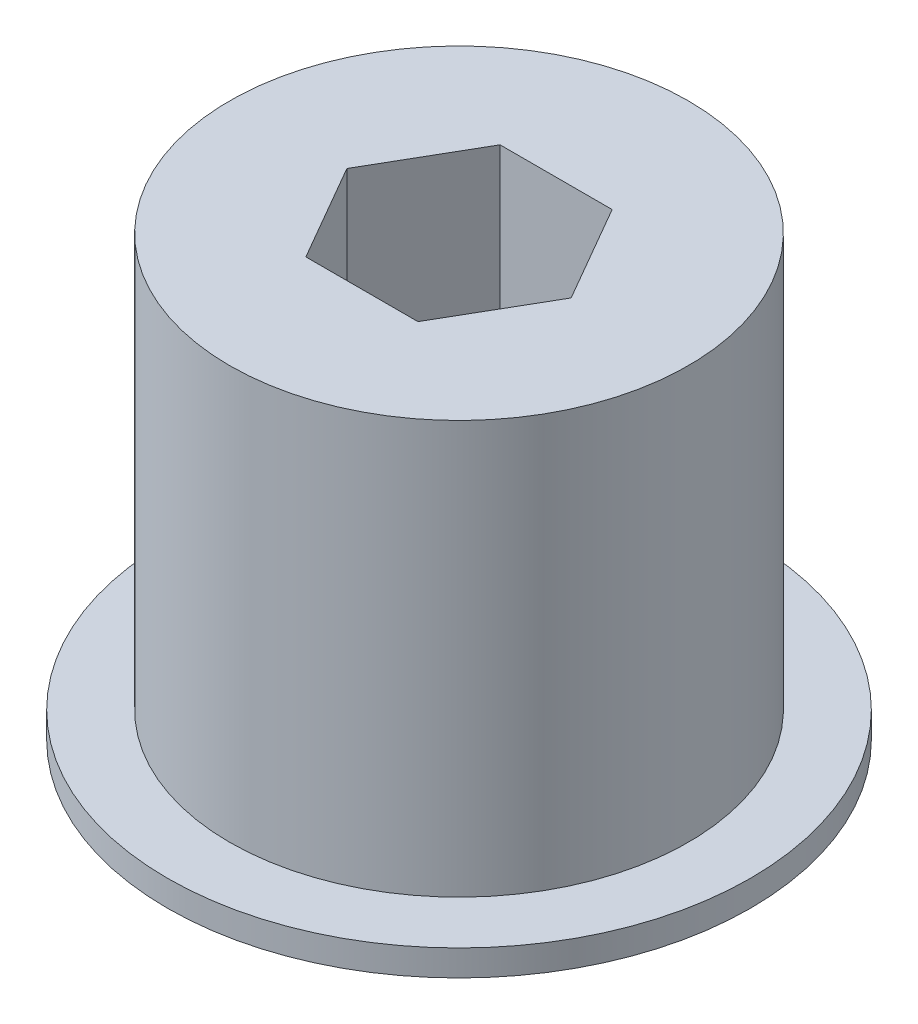
ISO-10303-21;
HEADER;
FILE_DESCRIPTION(('STEP AP214'),'2;1');
FILE_NAME('part.step','',(''),(''),'','','');
FILE_SCHEMA(('AUTOMOTIVE_DESIGN { 1 0 10303 214 1 1 1 1 }'));
ENDSEC;
DATA;
#1=APPLICATION_CONTEXT('core data for automotive mechanical design processes');
#2=APPLICATION_PROTOCOL_DEFINITION('international standard','automotive_design',2000,#1);
#3=PRODUCT_CONTEXT('',#1,'mechanical');
#4=PRODUCT('Part','Part','',(#3));
#5=PRODUCT_RELATED_PRODUCT_CATEGORY('part','',(#4));
#6=PRODUCT_DEFINITION_FORMATION('','',#4);
#7=PRODUCT_DEFINITION_CONTEXT('part definition',#1,'design');
#8=PRODUCT_DEFINITION('design','',#6,#7);
#9=PRODUCT_DEFINITION_SHAPE('','',#8);
#10=(LENGTH_UNIT() NAMED_UNIT(*) SI_UNIT(.MILLI.,.METRE.));
#11=(NAMED_UNIT(*) PLANE_ANGLE_UNIT() SI_UNIT($,.RADIAN.));
#12=(NAMED_UNIT(*) SI_UNIT($,.STERADIAN.) SOLID_ANGLE_UNIT());
#13=UNCERTAINTY_MEASURE_WITH_UNIT(LENGTH_MEASURE(1.E-05),#10,'distance_accuracy_value','');
#14=(GEOMETRIC_REPRESENTATION_CONTEXT(3) GLOBAL_UNCERTAINTY_ASSIGNED_CONTEXT((#13)) GLOBAL_UNIT_ASSIGNED_CONTEXT((#10,
#11,#12)) REPRESENTATION_CONTEXT('',''));
#15=CARTESIAN_POINT('',(0.,0.,0.));
#16=DIRECTION('',(0.,0.,1.));
#17=DIRECTION('',(1.,0.,0.));
#18=AXIS2_PLACEMENT_3D('',#15,#16,#17);
#19=CARTESIAN_POINT('',(0.,27.,0.));
#20=DIRECTION('',(0.,-1.,0.));
#21=DIRECTION('',(0.,0.,-1.));
#22=AXIS2_PLACEMENT_3D('',#19,#20,#21);
#23=CYLINDRICAL_SURFACE('',#22,15.);
#24=CARTESIAN_POINT('',(0.,27.,0.));
#25=DIRECTION('',(0.,1.,0.));
#26=DIRECTION('',(0.,0.,1.));
#27=AXIS2_PLACEMENT_3D('',#24,#25,#26);
#28=CIRCLE('',#27,15.);
#29=CARTESIAN_POINT('',(0.,27.,15.));
#30=VERTEX_POINT('',#29);
#31=EDGE_CURVE('E11',#30,#30,#28,.T.);
#32=ORIENTED_EDGE('',*,*,#31,.F.);
#33=EDGE_LOOP('',(#32));
#34=FACE_BOUND('',#33,.T.);
#35=CARTESIAN_POINT('',(0.,0.,0.));
#36=DIRECTION('',(0.,1.,0.));
#37=DIRECTION('',(0.,0.,1.));
#38=AXIS2_PLACEMENT_3D('',#35,#36,#37);
#39=CIRCLE('',#38,15.);
#40=CARTESIAN_POINT('',(0.,0.,15.));
#41=VERTEX_POINT('',#40);
#42=EDGE_CURVE('E40',#41,#41,#39,.T.);
#43=ORIENTED_EDGE('',*,*,#42,.T.);
#44=EDGE_LOOP('',(#43));
#45=FACE_BOUND('',#44,.T.);
#46=ADVANCED_FACE('F37',(#34,#45),#23,.T.);
#47=CARTESIAN_POINT('',(0.,27.,0.));
#48=DIRECTION('',(0.,1.,0.));
#49=DIRECTION('',(0.,0.,1.));
#50=AXIS2_PLACEMENT_3D('',#47,#48,#49);
#51=PLANE('',#50);
#52=DIRECTION('',(-1.,0.,0.));
#53=VECTOR('',#52,1.);
#54=CARTESIAN_POINT('',(3.66617420935413,27.,6.35));
#55=LINE('',#54,#53);
#56=CARTESIAN_POINT('',(3.66617420935413,27.,6.35));
#57=VERTEX_POINT('',#56);
#58=CARTESIAN_POINT('',(-3.66617420935412,27.,6.35));
#59=VERTEX_POINT('',#58);
#60=EDGE_CURVE('E91',#57,#59,#55,.T.);
#61=ORIENTED_EDGE('',*,*,#60,.T.);
#62=DIRECTION('',(-0.5,0.,-0.866025403784439));
#63=VECTOR('',#62,1.);
#64=CARTESIAN_POINT('',(-3.66617420935412,27.,6.35));
#65=LINE('',#64,#63);
#66=CARTESIAN_POINT('',(-7.33234841870825,27.,0.));
#67=VERTEX_POINT('',#66);
#68=EDGE_CURVE('E100',#59,#67,#65,.T.);
#69=ORIENTED_EDGE('',*,*,#68,.T.);
#70=DIRECTION('',(0.5,0.,-0.866025403784439));
#71=VECTOR('',#70,1.);
#72=CARTESIAN_POINT('',(-7.33234841870825,27.,0.));
#73=LINE('',#72,#71);
#74=CARTESIAN_POINT('',(-3.66617420935412,27.,-6.35));
#75=VERTEX_POINT('',#74);
#76=EDGE_CURVE('E51',#67,#75,#73,.T.);
#77=ORIENTED_EDGE('',*,*,#76,.T.);
#78=DIRECTION('',(1.,0.,0.));
#79=VECTOR('',#78,1.);
#80=CARTESIAN_POINT('',(-3.66617420935412,27.,-6.35));
#81=LINE('',#80,#79);
#82=CARTESIAN_POINT('',(3.66617420935412,27.,-6.35));
#83=VERTEX_POINT('',#82);
#84=EDGE_CURVE('E115',#75,#83,#81,.T.);
#85=ORIENTED_EDGE('',*,*,#84,.T.);
#86=DIRECTION('',(0.5,0.,0.866025403784439));
#87=VECTOR('',#86,1.);
#88=CARTESIAN_POINT('',(3.66617420935412,27.,-6.35));
#89=LINE('',#88,#87);
#90=CARTESIAN_POINT('',(7.33234841870825,27.,0.));
#91=VERTEX_POINT('',#90);
#92=EDGE_CURVE('E118',#83,#91,#89,.T.);
#93=ORIENTED_EDGE('',*,*,#92,.T.);
#94=DIRECTION('',(-0.5,0.,0.866025403784439));
#95=VECTOR('',#94,1.);
#96=CARTESIAN_POINT('',(7.33234841870825,27.,0.));
#97=LINE('',#96,#95);
#98=EDGE_CURVE('E97',#91,#57,#97,.T.);
#99=ORIENTED_EDGE('',*,*,#98,.T.);
#100=EDGE_LOOP('',(#61,#69,#77,#85,#93,#99));
#101=FACE_BOUND('',#100,.T.);
#102=ORIENTED_EDGE('',*,*,#31,.T.);
#103=EDGE_LOOP('',(#102));
#104=FACE_BOUND('',#103,.T.);
#105=ADVANCED_FACE('F104',(#101,#104),#51,.T.);
#106=CARTESIAN_POINT('',(0.,-1.7,0.));
#107=DIRECTION('',(0.,1.,0.));
#108=DIRECTION('',(0.,0.,1.));
#109=AXIS2_PLACEMENT_3D('',#106,#107,#108);
#110=CYLINDRICAL_SURFACE('',#109,19.07);
#111=CARTESIAN_POINT('',(0.,-1.7,0.));
#112=DIRECTION('',(0.,-1.,0.));
#113=DIRECTION('',(0.,0.,-1.));
#114=AXIS2_PLACEMENT_3D('',#111,#112,#113);
#115=CIRCLE('',#114,19.07);
#116=CARTESIAN_POINT('',(0.,-1.7,-19.07));
#117=VERTEX_POINT('',#116);
#118=EDGE_CURVE('E142',#117,#117,#115,.T.);
#119=ORIENTED_EDGE('',*,*,#118,.F.);
#120=EDGE_LOOP('',(#119));
#121=FACE_BOUND('',#120,.T.);
#122=CARTESIAN_POINT('',(0.,0.,0.));
#123=DIRECTION('',(0.,-1.,0.));
#124=DIRECTION('',(0.,0.,-1.));
#125=AXIS2_PLACEMENT_3D('',#122,#123,#124);
#126=CIRCLE('',#125,19.07);
#127=CARTESIAN_POINT('',(0.,0.,-19.07));
#128=VERTEX_POINT('',#127);
#129=EDGE_CURVE('E134',#128,#128,#126,.T.);
#130=ORIENTED_EDGE('',*,*,#129,.T.);
#131=EDGE_LOOP('',(#130));
#132=FACE_BOUND('',#131,.T.);
#133=ADVANCED_FACE('F148',(#121,#132),#110,.T.);
#134=CARTESIAN_POINT('',(0.,-1.7,0.));
#135=DIRECTION('',(0.,-1.,0.));
#136=DIRECTION('',(0.,0.,-1.));
#137=AXIS2_PLACEMENT_3D('',#134,#135,#136);
#138=PLANE('',#137);
#139=DIRECTION('',(-1.,0.,0.));
#140=VECTOR('',#139,1.);
#141=CARTESIAN_POINT('',(3.66617420935413,-1.7,6.35));
#142=LINE('',#141,#140);
#143=CARTESIAN_POINT('',(3.66617420935413,-1.7,6.35));
#144=VERTEX_POINT('',#143);
#145=CARTESIAN_POINT('',(-3.66617420935413,-1.7,6.35));
#146=VERTEX_POINT('',#145);
#147=EDGE_CURVE('E59',#144,#146,#142,.T.);
#148=ORIENTED_EDGE('',*,*,#147,.F.);
#149=DIRECTION('',(-0.5,0.,0.866025403784439));
#150=VECTOR('',#149,1.);
#151=CARTESIAN_POINT('',(7.33234841870825,-1.7,0.));
#152=LINE('',#151,#150);
#153=CARTESIAN_POINT('',(7.33234841870825,-1.7,0.));
#154=VERTEX_POINT('',#153);
#155=EDGE_CURVE('E108',#154,#144,#152,.T.);
#156=ORIENTED_EDGE('',*,*,#155,.F.);
#157=DIRECTION('',(0.5,0.,0.866025403784439));
#158=VECTOR('',#157,1.);
#159=CARTESIAN_POINT('',(3.66617420935412,-1.7,-6.35));
#160=LINE('',#159,#158);
#161=CARTESIAN_POINT('',(3.66617420935412,-1.7,-6.35));
#162=VERTEX_POINT('',#161);
#163=EDGE_CURVE('E111',#162,#154,#160,.T.);
#164=ORIENTED_EDGE('',*,*,#163,.F.);
#165=DIRECTION('',(1.,0.,0.));
#166=VECTOR('',#165,1.);
#167=CARTESIAN_POINT('',(-3.66617420935412,-1.7,-6.35));
#168=LINE('',#167,#166);
#169=CARTESIAN_POINT('',(-3.66617420935412,-1.7,-6.35));
#170=VERTEX_POINT('',#169);
#171=EDGE_CURVE('E127',#170,#162,#168,.T.);
#172=ORIENTED_EDGE('',*,*,#171,.F.);
#173=DIRECTION('',(0.5,0.,-0.866025403784439));
#174=VECTOR('',#173,1.);
#175=CARTESIAN_POINT('',(-7.33234841870825,-1.7,0.));
#176=LINE('',#175,#174);
#177=CARTESIAN_POINT('',(-7.33234841870825,-1.7,0.));
#178=VERTEX_POINT('',#177);
#179=EDGE_CURVE('E124',#178,#170,#176,.T.);
#180=ORIENTED_EDGE('',*,*,#179,.F.);
#181=DIRECTION('',(-0.5,0.,-0.866025403784439));
#182=VECTOR('',#181,1.);
#183=CARTESIAN_POINT('',(-3.66617420935412,-1.7,6.35));
#184=LINE('',#183,#182);
#185=EDGE_CURVE('E122',#146,#178,#184,.T.);
#186=ORIENTED_EDGE('',*,*,#185,.F.);
#187=EDGE_LOOP('',(#148,#156,#164,#172,#180,#186));
#188=FACE_BOUND('',#187,.T.);
#189=ORIENTED_EDGE('',*,*,#118,.T.);
#190=EDGE_LOOP('',(#189));
#191=FACE_BOUND('',#190,.T.);
#192=ADVANCED_FACE('F152',(#188,#191),#138,.T.);
#193=CARTESIAN_POINT('',(0.,0.,0.));
#194=DIRECTION('',(0.,-1.,0.));
#195=DIRECTION('',(0.,0.,-1.));
#196=AXIS2_PLACEMENT_3D('',#193,#194,#195);
#197=PLANE('',#196);
#198=ORIENTED_EDGE('',*,*,#42,.F.);
#199=EDGE_LOOP('',(#198));
#200=FACE_BOUND('',#199,.T.);
#201=ORIENTED_EDGE('',*,*,#129,.F.);
#202=EDGE_LOOP('',(#201));
#203=FACE_BOUND('',#202,.T.);
#204=ADVANCED_FACE('F150',(#200,#203),#197,.F.);
#205=CARTESIAN_POINT('',(3.66617420935413,27.,6.35));
#206=DIRECTION('',(0.,0.,1.));
#207=DIRECTION('',(1.,0.,0.));
#208=AXIS2_PLACEMENT_3D('',#205,#206,#207);
#209=PLANE('',#208);
#210=ORIENTED_EDGE('',*,*,#147,.T.);
#211=DIRECTION('',(0.,-1.,0.));
#212=VECTOR('',#211,1.);
#213=CARTESIAN_POINT('',(-3.66617420935412,27.,6.35));
#214=LINE('',#213,#212);
#215=EDGE_CURVE('E87',#59,#146,#214,.T.);
#216=ORIENTED_EDGE('',*,*,#215,.F.);
#217=ORIENTED_EDGE('',*,*,#60,.F.);
#218=DIRECTION('',(0.,-1.,0.));
#219=VECTOR('',#218,1.);
#220=CARTESIAN_POINT('',(3.66617420935413,27.,6.35));
#221=LINE('',#220,#219);
#222=EDGE_CURVE('E132',#57,#144,#221,.T.);
#223=ORIENTED_EDGE('',*,*,#222,.T.);
#224=EDGE_LOOP('',(#210,#216,#217,#223));
#225=FACE_BOUND('',#224,.T.);
#226=ADVANCED_FACE('F89',(#225),#209,.F.);
#227=CARTESIAN_POINT('',(7.33234841870825,27.,0.));
#228=DIRECTION('',(0.866025403784439,0.,0.5));
#229=DIRECTION('',(0.5,0.,-0.866025403784439));
#230=AXIS2_PLACEMENT_3D('',#227,#228,#229);
#231=PLANE('',#230);
#232=ORIENTED_EDGE('',*,*,#155,.T.);
#233=ORIENTED_EDGE('',*,*,#222,.F.);
#234=ORIENTED_EDGE('',*,*,#98,.F.);
#235=DIRECTION('',(0.,-1.,0.));
#236=VECTOR('',#235,1.);
#237=CARTESIAN_POINT('',(7.33234841870825,27.,0.));
#238=LINE('',#237,#236);
#239=EDGE_CURVE('E135',#91,#154,#238,.T.);
#240=ORIENTED_EDGE('',*,*,#239,.T.);
#241=EDGE_LOOP('',(#232,#233,#234,#240));
#242=FACE_BOUND('',#241,.T.);
#243=ADVANCED_FACE('F159',(#242),#231,.F.);
#244=CARTESIAN_POINT('',(3.66617420935412,27.,-6.35));
#245=DIRECTION('',(0.866025403784439,0.,-0.5));
#246=DIRECTION('',(-0.5,0.,-0.866025403784439));
#247=AXIS2_PLACEMENT_3D('',#244,#245,#246);
#248=PLANE('',#247);
#249=ORIENTED_EDGE('',*,*,#163,.T.);
#250=ORIENTED_EDGE('',*,*,#239,.F.);
#251=ORIENTED_EDGE('',*,*,#92,.F.);
#252=DIRECTION('',(0.,-1.,0.));
#253=VECTOR('',#252,1.);
#254=CARTESIAN_POINT('',(3.66617420935412,27.,-6.35));
#255=LINE('',#254,#253);
#256=EDGE_CURVE('E137',#83,#162,#255,.T.);
#257=ORIENTED_EDGE('',*,*,#256,.T.);
#258=EDGE_LOOP('',(#249,#250,#251,#257));
#259=FACE_BOUND('',#258,.T.);
#260=ADVANCED_FACE('F203',(#259),#248,.F.);
#261=CARTESIAN_POINT('',(-3.66617420935412,27.,-6.35));
#262=DIRECTION('',(0.,0.,-1.));
#263=DIRECTION('',(-1.,0.,0.));
#264=AXIS2_PLACEMENT_3D('',#261,#262,#263);
#265=PLANE('',#264);
#266=ORIENTED_EDGE('',*,*,#171,.T.);
#267=ORIENTED_EDGE('',*,*,#256,.F.);
#268=ORIENTED_EDGE('',*,*,#84,.F.);
#269=DIRECTION('',(0.,-1.,0.));
#270=VECTOR('',#269,1.);
#271=CARTESIAN_POINT('',(-3.66617420935412,27.,-6.35));
#272=LINE('',#271,#270);
#273=EDGE_CURVE('E139',#75,#170,#272,.T.);
#274=ORIENTED_EDGE('',*,*,#273,.T.);
#275=EDGE_LOOP('',(#266,#267,#268,#274));
#276=FACE_BOUND('',#275,.T.);
#277=ADVANCED_FACE('F213',(#276),#265,.F.);
#278=CARTESIAN_POINT('',(-7.33234841870825,27.,0.));
#279=DIRECTION('',(-0.866025403784439,0.,-0.5));
#280=DIRECTION('',(-0.5,0.,0.866025403784439));
#281=AXIS2_PLACEMENT_3D('',#278,#279,#280);
#282=PLANE('',#281);
#283=ORIENTED_EDGE('',*,*,#179,.T.);
#284=ORIENTED_EDGE('',*,*,#273,.F.);
#285=ORIENTED_EDGE('',*,*,#76,.F.);
#286=DIRECTION('',(0.,-1.,0.));
#287=VECTOR('',#286,1.);
#288=CARTESIAN_POINT('',(-7.33234841870825,27.,0.));
#289=LINE('',#288,#287);
#290=EDGE_CURVE('E96',#67,#178,#289,.T.);
#291=ORIENTED_EDGE('',*,*,#290,.T.);
#292=EDGE_LOOP('',(#283,#284,#285,#291));
#293=FACE_BOUND('',#292,.T.);
#294=ADVANCED_FACE('F223',(#293),#282,.F.);
#295=CARTESIAN_POINT('',(-3.66617420935412,27.,6.35));
#296=DIRECTION('',(-0.866025403784439,0.,0.5));
#297=DIRECTION('',(0.5,0.,0.866025403784439));
#298=AXIS2_PLACEMENT_3D('',#295,#296,#297);
#299=PLANE('',#298);
#300=ORIENTED_EDGE('',*,*,#185,.T.);
#301=ORIENTED_EDGE('',*,*,#290,.F.);
#302=ORIENTED_EDGE('',*,*,#68,.F.);
#303=ORIENTED_EDGE('',*,*,#215,.T.);
#304=EDGE_LOOP('',(#300,#301,#302,#303));
#305=FACE_BOUND('',#304,.T.);
#306=ADVANCED_FACE('F101',(#305),#299,.F.);
#307=CLOSED_SHELL('',(#46,#105,#133,#192,#204,#226,#243,#260,#277,#294,#306));
#308=MANIFOLD_SOLID_BREP('B2',#307);
#309=ADVANCED_BREP_SHAPE_REPRESENTATION('',(#18,#308),#14);
#310=SHAPE_DEFINITION_REPRESENTATION(#9,#309);
ENDSEC;
END-ISO-10303-21;
